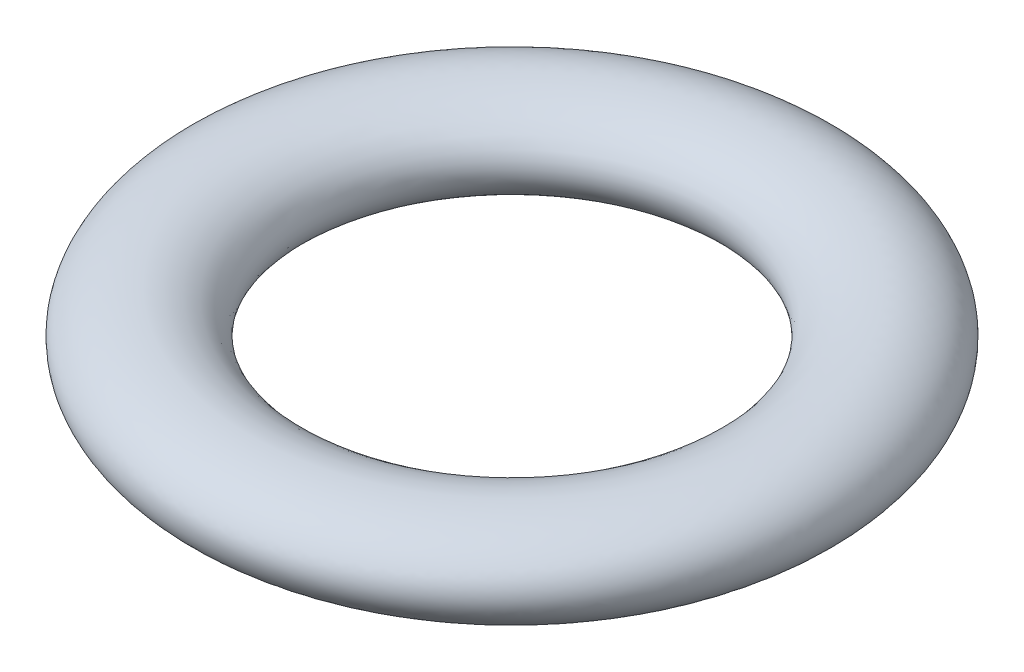
ISO-10303-21;
HEADER;
FILE_DESCRIPTION(('STEP AP214'),'2;1');
FILE_NAME('part.step','',(''),(''),'','','');
FILE_SCHEMA(('AUTOMOTIVE_DESIGN { 1 0 10303 214 1 1 1 1 }'));
ENDSEC;
DATA;
#1=APPLICATION_CONTEXT('core data for automotive mechanical design processes');
#2=APPLICATION_PROTOCOL_DEFINITION('international standard','automotive_design',2000,#1);
#3=PRODUCT_CONTEXT('',#1,'mechanical');
#4=PRODUCT('Part','Part','',(#3));
#5=PRODUCT_RELATED_PRODUCT_CATEGORY('part','',(#4));
#6=PRODUCT_DEFINITION_FORMATION('','',#4);
#7=PRODUCT_DEFINITION_CONTEXT('part definition',#1,'design');
#8=PRODUCT_DEFINITION('design','',#6,#7);
#9=PRODUCT_DEFINITION_SHAPE('','',#8);
#10=(LENGTH_UNIT() NAMED_UNIT(*) SI_UNIT(.MILLI.,.METRE.));
#11=(NAMED_UNIT(*) PLANE_ANGLE_UNIT() SI_UNIT($,.RADIAN.));
#12=(NAMED_UNIT(*) SI_UNIT($,.STERADIAN.) SOLID_ANGLE_UNIT());
#13=UNCERTAINTY_MEASURE_WITH_UNIT(LENGTH_MEASURE(1.E-05),#10,'distance_accuracy_value','');
#14=(GEOMETRIC_REPRESENTATION_CONTEXT(3) GLOBAL_UNCERTAINTY_ASSIGNED_CONTEXT((#13)) GLOBAL_UNIT_ASSIGNED_CONTEXT((#10,
#11,#12)) REPRESENTATION_CONTEXT('',''));
#15=CARTESIAN_POINT('',(0.,0.,0.));
#16=DIRECTION('',(0.,0.,1.));
#17=DIRECTION('',(1.,0.,0.));
#18=AXIS2_PLACEMENT_3D('',#15,#16,#17);
#19=CARTESIAN_POINT('',(12.,0.,0.));
#20=DIRECTION('',(0.,0.,1.));
#21=DIRECTION('',(1.,0.,0.));
#22=AXIS2_PLACEMENT_3D('',#19,#20,#21);
#23=ELLIPSE('',#22,2.99479166666667,2.);
#24=CARTESIAN_POINT('',(0.,-500.,0.));
#25=DIRECTION('',(0.,-1.,0.));
#26=AXIS1_PLACEMENT('',#24,#25);
#27=SURFACE_OF_REVOLUTION('',#23,#26);
#28=ADVANCED_FACE('F34',(),#27,.F.);
#29=CLOSED_SHELL('',(#28));
#30=MANIFOLD_SOLID_BREP('B2',#29);
#31=ADVANCED_BREP_SHAPE_REPRESENTATION('',(#18,#30),#14);
#32=SHAPE_DEFINITION_REPRESENTATION(#9,#31);
ENDSEC;
END-ISO-10303-21;
